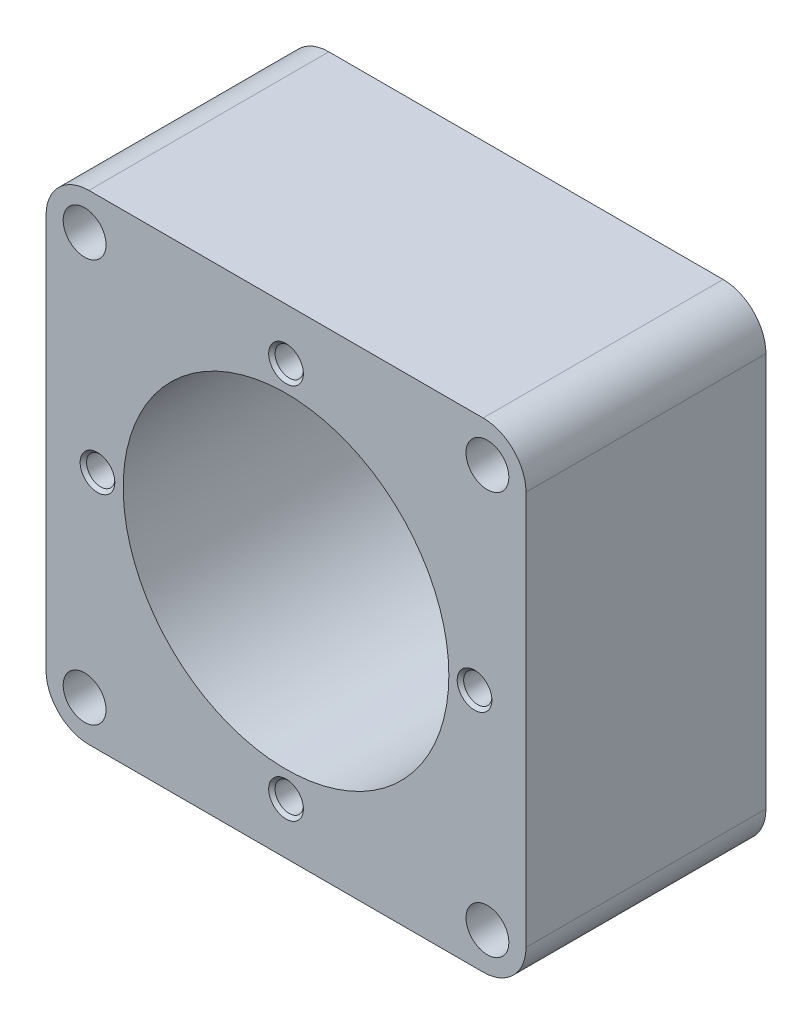
ISO-10303-21;
HEADER;
FILE_DESCRIPTION(('STEP AP214'),'2;1');
FILE_NAME('part.step','',(''),(''),'','','');
FILE_SCHEMA(('AUTOMOTIVE_DESIGN { 1 0 10303 214 1 1 1 1 }'));
ENDSEC;
DATA;
#1=APPLICATION_CONTEXT('core data for automotive mechanical design processes');
#2=APPLICATION_PROTOCOL_DEFINITION('international standard','automotive_design',2000,#1);
#3=PRODUCT_CONTEXT('',#1,'mechanical');
#4=PRODUCT('Part','Part','',(#3));
#5=PRODUCT_RELATED_PRODUCT_CATEGORY('part','',(#4));
#6=PRODUCT_DEFINITION_FORMATION('','',#4);
#7=PRODUCT_DEFINITION_CONTEXT('part definition',#1,'design');
#8=PRODUCT_DEFINITION('design','',#6,#7);
#9=PRODUCT_DEFINITION_SHAPE('','',#8);
#10=(LENGTH_UNIT() NAMED_UNIT(*) SI_UNIT(.MILLI.,.METRE.));
#11=(NAMED_UNIT(*) PLANE_ANGLE_UNIT() SI_UNIT($,.RADIAN.));
#12=(NAMED_UNIT(*) SI_UNIT($,.STERADIAN.) SOLID_ANGLE_UNIT());
#13=UNCERTAINTY_MEASURE_WITH_UNIT(LENGTH_MEASURE(1.E-05),#10,'distance_accuracy_value','');
#14=(GEOMETRIC_REPRESENTATION_CONTEXT(3) GLOBAL_UNCERTAINTY_ASSIGNED_CONTEXT((#13)) GLOBAL_UNIT_ASSIGNED_CONTEXT((#10,
#11,#12)) REPRESENTATION_CONTEXT('',''));
#15=CARTESIAN_POINT('',(0.,0.,0.));
#16=DIRECTION('',(0.,0.,1.));
#17=DIRECTION('',(1.,0.,0.));
#18=AXIS2_PLACEMENT_3D('',#15,#16,#17);
#19=CARTESIAN_POINT('',(28.,-28.,-28.));
#20=DIRECTION('',(1.,0.,0.));
#21=DIRECTION('',(0.,0.,-1.));
#22=AXIS2_PLACEMENT_3D('',#19,#20,#21);
#23=PLANE('',#22);
#24=DIRECTION('',(0.,1.,0.));
#25=VECTOR('',#24,1.);
#26=CARTESIAN_POINT('',(28.,-28.,0.));
#27=LINE('',#26,#25);
#28=CARTESIAN_POINT('',(28.,-23.,0.));
#29=VERTEX_POINT('',#28);
#30=CARTESIAN_POINT('',(28.,23.,0.));
#31=VERTEX_POINT('',#30);
#32=EDGE_CURVE('E185',#29,#31,#27,.T.);
#33=ORIENTED_EDGE('',*,*,#32,.F.);
#34=DIRECTION('',(0.,0.,1.));
#35=VECTOR('',#34,1.);
#36=CARTESIAN_POINT('',(28.,-23.,-28.));
#37=LINE('',#36,#35);
#38=CARTESIAN_POINT('',(28.,-23.,-28.));
#39=VERTEX_POINT('',#38);
#40=EDGE_CURVE('E226',#29,#39,#37,.F.);
#41=ORIENTED_EDGE('',*,*,#40,.T.);
#42=DIRECTION('',(0.,1.,0.));
#43=VECTOR('',#42,1.);
#44=CARTESIAN_POINT('',(28.,-28.,-28.));
#45=LINE('',#44,#43);
#46=CARTESIAN_POINT('',(28.,23.,-28.));
#47=VERTEX_POINT('',#46);
#48=EDGE_CURVE('E188',#39,#47,#45,.T.);
#49=ORIENTED_EDGE('',*,*,#48,.T.);
#50=DIRECTION('',(0.,0.,1.));
#51=VECTOR('',#50,1.);
#52=CARTESIAN_POINT('',(28.,23.,-28.));
#53=LINE('',#52,#51);
#54=EDGE_CURVE('E223',#47,#31,#53,.T.);
#55=ORIENTED_EDGE('',*,*,#54,.T.);
#56=EDGE_LOOP('',(#33,#41,#49,#55));
#57=FACE_BOUND('',#56,.T.);
#58=ADVANCED_FACE('F37',(#57),#23,.T.);
#59=CARTESIAN_POINT('',(-28.,-28.,-28.));
#60=DIRECTION('',(0.,-1.,0.));
#61=DIRECTION('',(0.,0.,-1.));
#62=AXIS2_PLACEMENT_3D('',#59,#60,#61);
#63=PLANE('',#62);
#64=DIRECTION('',(1.,0.,0.));
#65=VECTOR('',#64,1.);
#66=CARTESIAN_POINT('',(-28.,-28.,-28.));
#67=LINE('',#66,#65);
#68=CARTESIAN_POINT('',(-23.,-28.,-28.));
#69=VERTEX_POINT('',#68);
#70=CARTESIAN_POINT('',(23.,-28.,-28.));
#71=VERTEX_POINT('',#70);
#72=EDGE_CURVE('E197',#69,#71,#67,.T.);
#73=ORIENTED_EDGE('',*,*,#72,.T.);
#74=DIRECTION('',(0.,0.,1.));
#75=VECTOR('',#74,1.);
#76=CARTESIAN_POINT('',(23.,-28.,-28.));
#77=LINE('',#76,#75);
#78=CARTESIAN_POINT('',(23.,-28.,0.));
#79=VERTEX_POINT('',#78);
#80=EDGE_CURVE('E212',#71,#79,#77,.T.);
#81=ORIENTED_EDGE('',*,*,#80,.T.);
#82=DIRECTION('',(1.,0.,0.));
#83=VECTOR('',#82,1.);
#84=CARTESIAN_POINT('',(-28.,-28.,0.));
#85=LINE('',#84,#83);
#86=CARTESIAN_POINT('',(-23.,-28.,0.));
#87=VERTEX_POINT('',#86);
#88=EDGE_CURVE('E192',#87,#79,#85,.T.);
#89=ORIENTED_EDGE('',*,*,#88,.F.);
#90=DIRECTION('',(0.,0.,1.));
#91=VECTOR('',#90,1.);
#92=CARTESIAN_POINT('',(-23.,-28.,-28.));
#93=LINE('',#92,#91);
#94=EDGE_CURVE('E200',#87,#69,#93,.F.);
#95=ORIENTED_EDGE('',*,*,#94,.T.);
#96=EDGE_LOOP('',(#73,#81,#89,#95));
#97=FACE_BOUND('',#96,.T.);
#98=ADVANCED_FACE('F266',(#97),#63,.T.);
#99=CARTESIAN_POINT('',(-28.,-28.,-28.));
#100=DIRECTION('',(-1.,0.,0.));
#101=DIRECTION('',(0.,0.,1.));
#102=AXIS2_PLACEMENT_3D('',#99,#100,#101);
#103=PLANE('',#102);
#104=DIRECTION('',(0.,-1.,0.));
#105=VECTOR('',#104,1.);
#106=CARTESIAN_POINT('',(-28.,-28.,-28.));
#107=LINE('',#106,#105);
#108=CARTESIAN_POINT('',(-28.,23.,-28.));
#109=VERTEX_POINT('',#108);
#110=CARTESIAN_POINT('',(-28.,-23.,-28.));
#111=VERTEX_POINT('',#110);
#112=EDGE_CURVE('E194',#109,#111,#107,.T.);
#113=ORIENTED_EDGE('',*,*,#112,.T.);
#114=DIRECTION('',(0.,0.,1.));
#115=VECTOR('',#114,1.);
#116=CARTESIAN_POINT('',(-28.,-23.,-28.));
#117=LINE('',#116,#115);
#118=CARTESIAN_POINT('',(-28.,-23.,0.));
#119=VERTEX_POINT('',#118);
#120=EDGE_CURVE('E237',#111,#119,#117,.T.);
#121=ORIENTED_EDGE('',*,*,#120,.T.);
#122=DIRECTION('',(0.,-1.,0.));
#123=VECTOR('',#122,1.);
#124=CARTESIAN_POINT('',(-28.,-28.,0.));
#125=LINE('',#124,#123);
#126=CARTESIAN_POINT('',(-28.,23.,0.));
#127=VERTEX_POINT('',#126);
#128=EDGE_CURVE('E206',#127,#119,#125,.T.);
#129=ORIENTED_EDGE('',*,*,#128,.F.);
#130=DIRECTION('',(0.,0.,1.));
#131=VECTOR('',#130,1.);
#132=CARTESIAN_POINT('',(-28.,23.,-28.));
#133=LINE('',#132,#131);
#134=EDGE_CURVE('E235',#127,#109,#133,.F.);
#135=ORIENTED_EDGE('',*,*,#134,.T.);
#136=EDGE_LOOP('',(#113,#121,#129,#135));
#137=FACE_BOUND('',#136,.T.);
#138=ADVANCED_FACE('F242',(#137),#103,.T.);
#139=CARTESIAN_POINT('',(-28.,28.,-28.));
#140=DIRECTION('',(0.,1.,0.));
#141=DIRECTION('',(0.,0.,1.));
#142=AXIS2_PLACEMENT_3D('',#139,#140,#141);
#143=PLANE('',#142);
#144=DIRECTION('',(-1.,0.,0.));
#145=VECTOR('',#144,1.);
#146=CARTESIAN_POINT('',(-28.,28.,-28.));
#147=LINE('',#146,#145);
#148=CARTESIAN_POINT('',(23.,28.,-28.));
#149=VERTEX_POINT('',#148);
#150=CARTESIAN_POINT('',(-23.,28.,-28.));
#151=VERTEX_POINT('',#150);
#152=EDGE_CURVE('E191',#149,#151,#147,.T.);
#153=ORIENTED_EDGE('',*,*,#152,.T.);
#154=DIRECTION('',(0.,0.,1.));
#155=VECTOR('',#154,1.);
#156=CARTESIAN_POINT('',(-23.,28.,-28.));
#157=LINE('',#156,#155);
#158=CARTESIAN_POINT('',(-23.,28.,0.));
#159=VERTEX_POINT('',#158);
#160=EDGE_CURVE('E11',#151,#159,#157,.T.);
#161=ORIENTED_EDGE('',*,*,#160,.T.);
#162=DIRECTION('',(-1.,0.,0.));
#163=VECTOR('',#162,1.);
#164=CARTESIAN_POINT('',(-28.,28.,0.));
#165=LINE('',#164,#163);
#166=CARTESIAN_POINT('',(23.,28.,0.));
#167=VERTEX_POINT('',#166);
#168=EDGE_CURVE('E203',#167,#159,#165,.T.);
#169=ORIENTED_EDGE('',*,*,#168,.F.);
#170=DIRECTION('',(0.,0.,1.));
#171=VECTOR('',#170,1.);
#172=CARTESIAN_POINT('',(23.,28.,-28.));
#173=LINE('',#172,#171);
#174=EDGE_CURVE('E45',#167,#149,#173,.F.);
#175=ORIENTED_EDGE('',*,*,#174,.T.);
#176=EDGE_LOOP('',(#153,#161,#169,#175));
#177=FACE_BOUND('',#176,.T.);
#178=ADVANCED_FACE('F252',(#177),#143,.T.);
#179=CARTESIAN_POINT('',(0.,0.,-28.));
#180=DIRECTION('',(0.,0.,-1.));
#181=DIRECTION('',(-1.,0.,0.));
#182=AXIS2_PLACEMENT_3D('',#179,#180,#181);
#183=PLANE('',#182);
#184=CARTESIAN_POINT('',(-23.5,-23.5,-28.));
#185=DIRECTION('',(0.,0.,1.));
#186=DIRECTION('',(1.,0.,0.));
#187=AXIS2_PLACEMENT_3D('',#184,#185,#186);
#188=CIRCLE('',#187,2.5);
#189=CARTESIAN_POINT('',(-21.,-23.5,-28.));
#190=VERTEX_POINT('',#189);
#191=EDGE_CURVE('E177',#190,#190,#188,.T.);
#192=ORIENTED_EDGE('',*,*,#191,.T.);
#193=EDGE_LOOP('',(#192));
#194=FACE_BOUND('',#193,.T.);
#195=CARTESIAN_POINT('',(23.5,-23.5,-28.));
#196=DIRECTION('',(0.,0.,1.));
#197=DIRECTION('',(1.,0.,0.));
#198=AXIS2_PLACEMENT_3D('',#195,#196,#197);
#199=CIRCLE('',#198,2.5);
#200=CARTESIAN_POINT('',(26.,-23.5,-28.));
#201=VERTEX_POINT('',#200);
#202=EDGE_CURVE('E171',#201,#201,#199,.T.);
#203=ORIENTED_EDGE('',*,*,#202,.T.);
#204=EDGE_LOOP('',(#203));
#205=FACE_BOUND('',#204,.T.);
#206=CARTESIAN_POINT('',(23.5,23.5,-28.));
#207=DIRECTION('',(0.,0.,1.));
#208=DIRECTION('',(1.,0.,0.));
#209=AXIS2_PLACEMENT_3D('',#206,#207,#208);
#210=CIRCLE('',#209,2.5);
#211=CARTESIAN_POINT('',(26.,23.5,-28.));
#212=VERTEX_POINT('',#211);
#213=EDGE_CURVE('E165',#212,#212,#210,.T.);
#214=ORIENTED_EDGE('',*,*,#213,.T.);
#215=EDGE_LOOP('',(#214));
#216=FACE_BOUND('',#215,.T.);
#217=CARTESIAN_POINT('',(-23.5,23.5,-28.));
#218=DIRECTION('',(0.,0.,1.));
#219=DIRECTION('',(1.,0.,0.));
#220=AXIS2_PLACEMENT_3D('',#217,#218,#219);
#221=CIRCLE('',#220,2.5);
#222=CARTESIAN_POINT('',(-21.,23.5,-28.));
#223=VERTEX_POINT('',#222);
#224=EDGE_CURVE('E158',#223,#223,#221,.T.);
#225=ORIENTED_EDGE('',*,*,#224,.T.);
#226=EDGE_LOOP('',(#225));
#227=FACE_BOUND('',#226,.T.);
#228=CARTESIAN_POINT('',(0.,0.,-28.));
#229=DIRECTION('',(0.,0.,1.));
#230=DIRECTION('',(1.,0.,0.));
#231=AXIS2_PLACEMENT_3D('',#228,#229,#230);
#232=CIRCLE('',#231,19.);
#233=CARTESIAN_POINT('',(19.,0.,-28.));
#234=VERTEX_POINT('',#233);
#235=EDGE_CURVE('E182',#234,#234,#232,.T.);
#236=ORIENTED_EDGE('',*,*,#235,.T.);
#237=EDGE_LOOP('',(#236));
#238=FACE_BOUND('',#237,.T.);
#239=ORIENTED_EDGE('',*,*,#48,.F.);
#240=CARTESIAN_POINT('',(23.,-23.,-28.));
#241=DIRECTION('',(0.,0.,-1.));
#242=DIRECTION('',(-1.,0.,0.));
#243=AXIS2_PLACEMENT_3D('',#240,#241,#242);
#244=CIRCLE('',#243,5.);
#245=EDGE_CURVE('E233',#39,#71,#244,.T.);
#246=ORIENTED_EDGE('',*,*,#245,.T.);
#247=ORIENTED_EDGE('',*,*,#72,.F.);
#248=CARTESIAN_POINT('',(-23.,-23.,-28.));
#249=DIRECTION('',(0.,0.,-1.));
#250=DIRECTION('',(-1.,0.,0.));
#251=AXIS2_PLACEMENT_3D('',#248,#249,#250);
#252=CIRCLE('',#251,5.);
#253=EDGE_CURVE('E231',#69,#111,#252,.T.);
#254=ORIENTED_EDGE('',*,*,#253,.T.);
#255=ORIENTED_EDGE('',*,*,#112,.F.);
#256=CARTESIAN_POINT('',(-23.,23.,-28.));
#257=DIRECTION('',(0.,0.,-1.));
#258=DIRECTION('',(-1.,0.,0.));
#259=AXIS2_PLACEMENT_3D('',#256,#257,#258);
#260=CIRCLE('',#259,5.);
#261=EDGE_CURVE('E52',#109,#151,#260,.T.);
#262=ORIENTED_EDGE('',*,*,#261,.T.);
#263=ORIENTED_EDGE('',*,*,#152,.F.);
#264=CARTESIAN_POINT('',(23.,23.,-28.));
#265=DIRECTION('',(0.,0.,-1.));
#266=DIRECTION('',(-1.,0.,0.));
#267=AXIS2_PLACEMENT_3D('',#264,#265,#266);
#268=CIRCLE('',#267,5.);
#269=EDGE_CURVE('E228',#149,#47,#268,.T.);
#270=ORIENTED_EDGE('',*,*,#269,.T.);
#271=EDGE_LOOP('',(#239,#246,#247,#254,#255,#262,#263,#270));
#272=FACE_BOUND('',#271,.T.);
#273=ADVANCED_FACE('F255',(#194,#205,#216,#227,#238,#272),#183,.T.);
#274=CARTESIAN_POINT('',(0.,0.,0.));
#275=DIRECTION('',(0.,0.,-1.));
#276=DIRECTION('',(-1.,0.,0.));
#277=AXIS2_PLACEMENT_3D('',#274,#275,#276);
#278=PLANE('',#277);
#279=CARTESIAN_POINT('',(0.,22.,0.));
#280=DIRECTION('',(0.,0.,1.));
#281=DIRECTION('',(1.,0.,0.));
#282=AXIS2_PLACEMENT_3D('',#279,#280,#281);
#283=CIRCLE('',#282,2.025);
#284=CARTESIAN_POINT('',(2.025,22.,0.));
#285=VERTEX_POINT('',#284);
#286=EDGE_CURVE('E130',#285,#285,#283,.T.);
#287=ORIENTED_EDGE('',*,*,#286,.F.);
#288=EDGE_LOOP('',(#287));
#289=FACE_BOUND('',#288,.T.);
#290=CARTESIAN_POINT('',(-21.9999999999994,-6.23930495989826E-13,0.));
#291=DIRECTION('',(0.,0.,1.));
#292=DIRECTION('',(1.,0.,0.));
#293=AXIS2_PLACEMENT_3D('',#290,#291,#292);
#294=CIRCLE('',#293,2.025);
#295=CARTESIAN_POINT('',(-19.9749999999994,-6.23930495989826E-13,0.));
#296=VERTEX_POINT('',#295);
#297=EDGE_CURVE('E123',#296,#296,#294,.T.);
#298=ORIENTED_EDGE('',*,*,#297,.F.);
#299=EDGE_LOOP('',(#298));
#300=FACE_BOUND('',#299,.T.);
#301=CARTESIAN_POINT('',(1.2424725460634E-12,-22.,0.));
#302=DIRECTION('',(0.,0.,1.));
#303=DIRECTION('',(1.,0.,0.));
#304=AXIS2_PLACEMENT_3D('',#301,#302,#303);
#305=CIRCLE('',#304,2.025);
#306=CARTESIAN_POINT('',(2.02500000000124,-22.,0.));
#307=VERTEX_POINT('',#306);
#308=EDGE_CURVE('E139',#307,#307,#305,.T.);
#309=ORIENTED_EDGE('',*,*,#308,.F.);
#310=EDGE_LOOP('',(#309));
#311=FACE_BOUND('',#310,.T.);
#312=CARTESIAN_POINT('',(22.0000000000006,6.21236273031702E-13,0.));
#313=DIRECTION('',(0.,0.,1.));
#314=DIRECTION('',(1.,0.,0.));
#315=AXIS2_PLACEMENT_3D('',#312,#313,#314);
#316=CIRCLE('',#315,2.025);
#317=CARTESIAN_POINT('',(24.0250000000006,6.21236273031702E-13,0.));
#318=VERTEX_POINT('',#317);
#319=EDGE_CURVE('E148',#318,#318,#316,.T.);
#320=ORIENTED_EDGE('',*,*,#319,.F.);
#321=EDGE_LOOP('',(#320));
#322=FACE_BOUND('',#321,.T.);
#323=CARTESIAN_POINT('',(-23.5,-23.5,0.));
#324=DIRECTION('',(0.,0.,1.));
#325=DIRECTION('',(1.,0.,0.));
#326=AXIS2_PLACEMENT_3D('',#323,#324,#325);
#327=CIRCLE('',#326,2.5);
#328=CARTESIAN_POINT('',(-21.,-23.5,0.));
#329=VERTEX_POINT('',#328);
#330=EDGE_CURVE('E157',#329,#329,#327,.T.);
#331=ORIENTED_EDGE('',*,*,#330,.F.);
#332=EDGE_LOOP('',(#331));
#333=FACE_BOUND('',#332,.T.);
#334=CARTESIAN_POINT('',(23.5,-23.5,0.));
#335=DIRECTION('',(0.,0.,1.));
#336=DIRECTION('',(1.,0.,0.));
#337=AXIS2_PLACEMENT_3D('',#334,#335,#336);
#338=CIRCLE('',#337,2.5);
#339=CARTESIAN_POINT('',(26.,-23.5,0.));
#340=VERTEX_POINT('',#339);
#341=EDGE_CURVE('E174',#340,#340,#338,.T.);
#342=ORIENTED_EDGE('',*,*,#341,.F.);
#343=EDGE_LOOP('',(#342));
#344=FACE_BOUND('',#343,.T.);
#345=CARTESIAN_POINT('',(23.5,23.5,0.));
#346=DIRECTION('',(0.,0.,1.));
#347=DIRECTION('',(1.,0.,0.));
#348=AXIS2_PLACEMENT_3D('',#345,#346,#347);
#349=CIRCLE('',#348,2.5);
#350=CARTESIAN_POINT('',(26.,23.5,0.));
#351=VERTEX_POINT('',#350);
#352=EDGE_CURVE('E168',#351,#351,#349,.T.);
#353=ORIENTED_EDGE('',*,*,#352,.F.);
#354=EDGE_LOOP('',(#353));
#355=FACE_BOUND('',#354,.T.);
#356=CARTESIAN_POINT('',(-23.5,23.5,0.));
#357=DIRECTION('',(0.,0.,1.));
#358=DIRECTION('',(1.,0.,0.));
#359=AXIS2_PLACEMENT_3D('',#356,#357,#358);
#360=CIRCLE('',#359,2.5);
#361=CARTESIAN_POINT('',(-21.,23.5,0.));
#362=VERTEX_POINT('',#361);
#363=EDGE_CURVE('E162',#362,#362,#360,.T.);
#364=ORIENTED_EDGE('',*,*,#363,.F.);
#365=EDGE_LOOP('',(#364));
#366=FACE_BOUND('',#365,.T.);
#367=CARTESIAN_POINT('',(0.,0.,0.));
#368=DIRECTION('',(0.,0.,1.));
#369=DIRECTION('',(1.,0.,0.));
#370=AXIS2_PLACEMENT_3D('',#367,#368,#369);
#371=CIRCLE('',#370,19.);
#372=CARTESIAN_POINT('',(19.,0.,0.));
#373=VERTEX_POINT('',#372);
#374=EDGE_CURVE('E161',#373,#373,#371,.T.);
#375=ORIENTED_EDGE('',*,*,#374,.F.);
#376=EDGE_LOOP('',(#375));
#377=FACE_BOUND('',#376,.T.);
#378=ORIENTED_EDGE('',*,*,#88,.T.);
#379=CARTESIAN_POINT('',(23.,-23.,0.));
#380=DIRECTION('',(0.,0.,-1.));
#381=DIRECTION('',(-1.,0.,0.));
#382=AXIS2_PLACEMENT_3D('',#379,#380,#381);
#383=CIRCLE('',#382,5.);
#384=EDGE_CURVE('E221',#79,#29,#383,.F.);
#385=ORIENTED_EDGE('',*,*,#384,.T.);
#386=ORIENTED_EDGE('',*,*,#32,.T.);
#387=CARTESIAN_POINT('',(23.,23.,0.));
#388=DIRECTION('',(0.,0.,-1.));
#389=DIRECTION('',(-1.,0.,0.));
#390=AXIS2_PLACEMENT_3D('',#387,#388,#389);
#391=CIRCLE('',#390,5.);
#392=EDGE_CURVE('E215',#31,#167,#391,.F.);
#393=ORIENTED_EDGE('',*,*,#392,.T.);
#394=ORIENTED_EDGE('',*,*,#168,.T.);
#395=CARTESIAN_POINT('',(-23.,23.,0.));
#396=DIRECTION('',(0.,0.,-1.));
#397=DIRECTION('',(-1.,0.,0.));
#398=AXIS2_PLACEMENT_3D('',#395,#396,#397);
#399=CIRCLE('',#398,5.);
#400=EDGE_CURVE('E217',#159,#127,#399,.F.);
#401=ORIENTED_EDGE('',*,*,#400,.T.);
#402=ORIENTED_EDGE('',*,*,#128,.T.);
#403=CARTESIAN_POINT('',(-23.,-23.,0.));
#404=DIRECTION('',(0.,0.,-1.));
#405=DIRECTION('',(-1.,0.,0.));
#406=AXIS2_PLACEMENT_3D('',#403,#404,#405);
#407=CIRCLE('',#406,5.);
#408=EDGE_CURVE('E219',#119,#87,#407,.F.);
#409=ORIENTED_EDGE('',*,*,#408,.T.);
#410=EDGE_LOOP('',(#378,#385,#386,#393,#394,#401,#402,#409));
#411=FACE_BOUND('',#410,.T.);
#412=ADVANCED_FACE('F247',(#289,#300,#311,#322,#333,#344,#355,#366,#377,#411),#278,.F.);
#413=CARTESIAN_POINT('',(0.,0.,-28.));
#414=DIRECTION('',(0.,0.,1.));
#415=DIRECTION('',(1.,0.,0.));
#416=AXIS2_PLACEMENT_3D('',#413,#414,#415);
#417=CYLINDRICAL_SURFACE('',#416,19.);
#418=ORIENTED_EDGE('',*,*,#235,.F.);
#419=EDGE_LOOP('',(#418));
#420=FACE_BOUND('',#419,.T.);
#421=ORIENTED_EDGE('',*,*,#374,.T.);
#422=EDGE_LOOP('',(#421));
#423=FACE_BOUND('',#422,.T.);
#424=ADVANCED_FACE('F291',(#420,#423),#417,.F.);
#425=CARTESIAN_POINT('',(-23.5,23.5,-28.));
#426=DIRECTION('',(0.,0.,1.));
#427=DIRECTION('',(1.,0.,0.));
#428=AXIS2_PLACEMENT_3D('',#425,#426,#427);
#429=CYLINDRICAL_SURFACE('',#428,2.5);
#430=ORIENTED_EDGE('',*,*,#224,.F.);
#431=EDGE_LOOP('',(#430));
#432=FACE_BOUND('',#431,.T.);
#433=ORIENTED_EDGE('',*,*,#363,.T.);
#434=EDGE_LOOP('',(#433));
#435=FACE_BOUND('',#434,.T.);
#436=ADVANCED_FACE('F298',(#432,#435),#429,.F.);
#437=CARTESIAN_POINT('',(23.5,23.5,-28.));
#438=DIRECTION('',(0.,0.,1.));
#439=DIRECTION('',(1.,0.,0.));
#440=AXIS2_PLACEMENT_3D('',#437,#438,#439);
#441=CYLINDRICAL_SURFACE('',#440,2.5);
#442=ORIENTED_EDGE('',*,*,#213,.F.);
#443=EDGE_LOOP('',(#442));
#444=FACE_BOUND('',#443,.T.);
#445=ORIENTED_EDGE('',*,*,#352,.T.);
#446=EDGE_LOOP('',(#445));
#447=FACE_BOUND('',#446,.T.);
#448=ADVANCED_FACE('F306',(#444,#447),#441,.F.);
#449=CARTESIAN_POINT('',(23.5,-23.5,-28.));
#450=DIRECTION('',(0.,0.,1.));
#451=DIRECTION('',(1.,0.,0.));
#452=AXIS2_PLACEMENT_3D('',#449,#450,#451);
#453=CYLINDRICAL_SURFACE('',#452,2.5);
#454=ORIENTED_EDGE('',*,*,#202,.F.);
#455=EDGE_LOOP('',(#454));
#456=FACE_BOUND('',#455,.T.);
#457=ORIENTED_EDGE('',*,*,#341,.T.);
#458=EDGE_LOOP('',(#457));
#459=FACE_BOUND('',#458,.T.);
#460=ADVANCED_FACE('F302',(#456,#459),#453,.F.);
#461=CARTESIAN_POINT('',(-23.5,-23.5,-28.));
#462=DIRECTION('',(0.,0.,1.));
#463=DIRECTION('',(1.,0.,0.));
#464=AXIS2_PLACEMENT_3D('',#461,#462,#463);
#465=CYLINDRICAL_SURFACE('',#464,2.5);
#466=ORIENTED_EDGE('',*,*,#191,.F.);
#467=EDGE_LOOP('',(#466));
#468=FACE_BOUND('',#467,.T.);
#469=ORIENTED_EDGE('',*,*,#330,.T.);
#470=EDGE_LOOP('',(#469));
#471=FACE_BOUND('',#470,.T.);
#472=ADVANCED_FACE('F276',(#468,#471),#465,.F.);
#473=CARTESIAN_POINT('',(23.,-23.,-28.));
#474=DIRECTION('',(0.,0.,1.));
#475=DIRECTION('',(1.,0.,0.));
#476=AXIS2_PLACEMENT_3D('',#473,#474,#475);
#477=CYLINDRICAL_SURFACE('',#476,5.);
#478=ORIENTED_EDGE('',*,*,#245,.F.);
#479=ORIENTED_EDGE('',*,*,#40,.F.);
#480=ORIENTED_EDGE('',*,*,#384,.F.);
#481=ORIENTED_EDGE('',*,*,#80,.F.);
#482=EDGE_LOOP('',(#478,#479,#480,#481));
#483=FACE_BOUND('',#482,.T.);
#484=ADVANCED_FACE('F264',(#483),#477,.T.);
#485=CARTESIAN_POINT('',(-23.,-23.,-28.));
#486=DIRECTION('',(0.,0.,1.));
#487=DIRECTION('',(1.,0.,0.));
#488=AXIS2_PLACEMENT_3D('',#485,#486,#487);
#489=CYLINDRICAL_SURFACE('',#488,5.);
#490=ORIENTED_EDGE('',*,*,#253,.F.);
#491=ORIENTED_EDGE('',*,*,#94,.F.);
#492=ORIENTED_EDGE('',*,*,#408,.F.);
#493=ORIENTED_EDGE('',*,*,#120,.F.);
#494=EDGE_LOOP('',(#490,#491,#492,#493));
#495=FACE_BOUND('',#494,.T.);
#496=ADVANCED_FACE('F269',(#495),#489,.T.);
#497=CARTESIAN_POINT('',(-23.,23.,-28.));
#498=DIRECTION('',(0.,0.,1.));
#499=DIRECTION('',(1.,0.,0.));
#500=AXIS2_PLACEMENT_3D('',#497,#498,#499);
#501=CYLINDRICAL_SURFACE('',#500,5.);
#502=ORIENTED_EDGE('',*,*,#261,.F.);
#503=ORIENTED_EDGE('',*,*,#134,.F.);
#504=ORIENTED_EDGE('',*,*,#400,.F.);
#505=ORIENTED_EDGE('',*,*,#160,.F.);
#506=EDGE_LOOP('',(#502,#503,#504,#505));
#507=FACE_BOUND('',#506,.T.);
#508=ADVANCED_FACE('F251',(#507),#501,.T.);
#509=CARTESIAN_POINT('',(23.,23.,-28.));
#510=DIRECTION('',(0.,0.,1.));
#511=DIRECTION('',(1.,0.,0.));
#512=AXIS2_PLACEMENT_3D('',#509,#510,#511);
#513=CYLINDRICAL_SURFACE('',#512,5.);
#514=ORIENTED_EDGE('',*,*,#269,.F.);
#515=ORIENTED_EDGE('',*,*,#174,.F.);
#516=ORIENTED_EDGE('',*,*,#392,.F.);
#517=ORIENTED_EDGE('',*,*,#54,.F.);
#518=EDGE_LOOP('',(#514,#515,#516,#517));
#519=FACE_BOUND('',#518,.T.);
#520=ADVANCED_FACE('F39',(#519),#513,.T.);
#521=CARTESIAN_POINT('',(22.0000000000006,6.21236273031702E-13,-12.1));
#522=DIRECTION('',(0.,0.,1.));
#523=DIRECTION('',(1.,0.,0.));
#524=AXIS2_PLACEMENT_3D('',#521,#522,#523);
#525=CONICAL_SURFACE('',#524,1.65,1.02974425867665);
#526=CARTESIAN_POINT('',(22.0000000000006,6.21236273031702E-13,-13.0914200213955));
#527=VERTEX_POINT('',#526);
#528=VERTEX_LOOP('',#527);
#529=FACE_BOUND('',#528,.T.);
#530=CARTESIAN_POINT('',(22.0000000000006,6.21236273031702E-13,-12.1));
#531=DIRECTION('',(0.,0.,1.));
#532=DIRECTION('',(1.,0.,0.));
#533=AXIS2_PLACEMENT_3D('',#530,#531,#532);
#534=CIRCLE('',#533,1.65);
#535=CARTESIAN_POINT('',(23.6500000000006,6.21236273031702E-13,-12.1));
#536=VERTEX_POINT('',#535);
#537=EDGE_CURVE('E154',#536,#536,#534,.T.);
#538=ORIENTED_EDGE('',*,*,#537,.T.);
#539=EDGE_LOOP('',(#538));
#540=FACE_BOUND('',#539,.T.);
#541=ADVANCED_FACE('F314',(#529,#540),#525,.F.);
#542=CARTESIAN_POINT('',(22.0000000000006,6.21236273031702E-13,0.));
#543=DIRECTION('',(0.,0.,1.));
#544=DIRECTION('',(1.,0.,0.));
#545=AXIS2_PLACEMENT_3D('',#542,#543,#544);
#546=CYLINDRICAL_SURFACE('',#545,1.65);
#547=ORIENTED_EDGE('',*,*,#537,.F.);
#548=EDGE_LOOP('',(#547));
#549=FACE_BOUND('',#548,.T.);
#550=CARTESIAN_POINT('',(22.0000000000006,6.21236273031702E-13,-0.375));
#551=DIRECTION('',(0.,0.,1.));
#552=DIRECTION('',(1.,0.,0.));
#553=AXIS2_PLACEMENT_3D('',#550,#551,#552);
#554=CIRCLE('',#553,1.65);
#555=CARTESIAN_POINT('',(23.6500000000006,6.21236273031702E-13,-0.375));
#556=VERTEX_POINT('',#555);
#557=EDGE_CURVE('E151',#556,#556,#554,.T.);
#558=ORIENTED_EDGE('',*,*,#557,.T.);
#559=EDGE_LOOP('',(#558));
#560=FACE_BOUND('',#559,.T.);
#561=ADVANCED_FACE('F317',(#549,#560),#546,.F.);
#562=CARTESIAN_POINT('',(22.0000000000006,6.21236273031702E-13,0.));
#563=DIRECTION('',(0.,0.,1.));
#564=DIRECTION('',(1.,0.,0.));
#565=AXIS2_PLACEMENT_3D('',#562,#563,#564);
#566=CONICAL_SURFACE('',#565,2.025,0.785398163397446);
#567=ORIENTED_EDGE('',*,*,#557,.F.);
#568=EDGE_LOOP('',(#567));
#569=FACE_BOUND('',#568,.T.);
#570=ORIENTED_EDGE('',*,*,#319,.T.);
#571=EDGE_LOOP('',(#570));
#572=FACE_BOUND('',#571,.T.);
#573=ADVANCED_FACE('F321',(#569,#572),#566,.F.);
#574=CARTESIAN_POINT('',(1.2424725460634E-12,-22.,-12.1));
#575=DIRECTION('',(0.,0.,1.));
#576=DIRECTION('',(1.,0.,0.));
#577=AXIS2_PLACEMENT_3D('',#574,#575,#576);
#578=CONICAL_SURFACE('',#577,1.65,1.02974425867665);
#579=CARTESIAN_POINT('',(1.2392660729383E-12,-22.,-13.0914200213955));
#580=VERTEX_POINT('',#579);
#581=VERTEX_LOOP('',#580);
#582=FACE_BOUND('',#581,.T.);
#583=CARTESIAN_POINT('',(1.2424725460634E-12,-22.,-12.1));
#584=DIRECTION('',(0.,0.,1.));
#585=DIRECTION('',(1.,0.,0.));
#586=AXIS2_PLACEMENT_3D('',#583,#584,#585);
#587=CIRCLE('',#586,1.65);
#588=CARTESIAN_POINT('',(1.65000000000124,-22.,-12.1));
#589=VERTEX_POINT('',#588);
#590=EDGE_CURVE('E145',#589,#589,#587,.T.);
#591=ORIENTED_EDGE('',*,*,#590,.T.);
#592=EDGE_LOOP('',(#591));
#593=FACE_BOUND('',#592,.T.);
#594=ADVANCED_FACE('F325',(#582,#593),#578,.F.);
#595=CARTESIAN_POINT('',(1.2424725460634E-12,-22.,0.));
#596=DIRECTION('',(0.,0.,1.));
#597=DIRECTION('',(1.,0.,0.));
#598=AXIS2_PLACEMENT_3D('',#595,#596,#597);
#599=CYLINDRICAL_SURFACE('',#598,1.65);
#600=ORIENTED_EDGE('',*,*,#590,.F.);
#601=EDGE_LOOP('',(#600));
#602=FACE_BOUND('',#601,.T.);
#603=CARTESIAN_POINT('',(1.2424725460634E-12,-22.,-0.375));
#604=DIRECTION('',(0.,0.,1.));
#605=DIRECTION('',(1.,0.,0.));
#606=AXIS2_PLACEMENT_3D('',#603,#604,#605);
#607=CIRCLE('',#606,1.65);
#608=CARTESIAN_POINT('',(1.65000000000124,-22.,-0.375));
#609=VERTEX_POINT('',#608);
#610=EDGE_CURVE('E142',#609,#609,#607,.T.);
#611=ORIENTED_EDGE('',*,*,#610,.T.);
#612=EDGE_LOOP('',(#611));
#613=FACE_BOUND('',#612,.T.);
#614=ADVANCED_FACE('F329',(#602,#613),#599,.F.);
#615=CARTESIAN_POINT('',(1.2424725460634E-12,-22.,0.));
#616=DIRECTION('',(0.,0.,1.));
#617=DIRECTION('',(1.,0.,0.));
#618=AXIS2_PLACEMENT_3D('',#615,#616,#617);
#619=CONICAL_SURFACE('',#618,2.025,0.785398163397446);
#620=ORIENTED_EDGE('',*,*,#610,.F.);
#621=EDGE_LOOP('',(#620));
#622=FACE_BOUND('',#621,.T.);
#623=ORIENTED_EDGE('',*,*,#308,.T.);
#624=EDGE_LOOP('',(#623));
#625=FACE_BOUND('',#624,.T.);
#626=ADVANCED_FACE('F333',(#622,#625),#619,.F.);
#627=CARTESIAN_POINT('',(-21.9999999999994,-6.23930495989826E-13,-12.1));
#628=DIRECTION('',(0.,0.,1.));
#629=DIRECTION('',(1.,0.,0.));
#630=AXIS2_PLACEMENT_3D('',#627,#628,#629);
#631=CONICAL_SURFACE('',#630,1.65,1.02974425867665);
#632=CARTESIAN_POINT('',(-21.9999999999994,-6.23930495989826E-13,-13.0914200213955));
#633=VERTEX_POINT('',#632);
#634=VERTEX_LOOP('',#633);
#635=FACE_BOUND('',#634,.T.);
#636=CARTESIAN_POINT('',(-21.9999999999994,-6.23930495989826E-13,-12.1));
#637=DIRECTION('',(0.,0.,1.));
#638=DIRECTION('',(1.,0.,0.));
#639=AXIS2_PLACEMENT_3D('',#636,#637,#638);
#640=CIRCLE('',#639,1.65);
#641=CARTESIAN_POINT('',(-20.3499999999994,-6.23930495989826E-13,-12.1));
#642=VERTEX_POINT('',#641);
#643=EDGE_CURVE('E136',#642,#642,#640,.T.);
#644=ORIENTED_EDGE('',*,*,#643,.T.);
#645=EDGE_LOOP('',(#644));
#646=FACE_BOUND('',#645,.T.);
#647=ADVANCED_FACE('F337',(#635,#646),#631,.F.);
#648=CARTESIAN_POINT('',(-21.9999999999994,-6.23930495989826E-13,0.));
#649=DIRECTION('',(0.,0.,1.));
#650=DIRECTION('',(1.,0.,0.));
#651=AXIS2_PLACEMENT_3D('',#648,#649,#650);
#652=CYLINDRICAL_SURFACE('',#651,1.65);
#653=ORIENTED_EDGE('',*,*,#643,.F.);
#654=EDGE_LOOP('',(#653));
#655=FACE_BOUND('',#654,.T.);
#656=CARTESIAN_POINT('',(-21.9999999999994,-6.23930495989826E-13,-0.375));
#657=DIRECTION('',(0.,0.,1.));
#658=DIRECTION('',(1.,0.,0.));
#659=AXIS2_PLACEMENT_3D('',#656,#657,#658);
#660=CIRCLE('',#659,1.65);
#661=CARTESIAN_POINT('',(-20.3499999999994,-6.23930495989826E-13,-0.375));
#662=VERTEX_POINT('',#661);
#663=EDGE_CURVE('E127',#662,#662,#660,.T.);
#664=ORIENTED_EDGE('',*,*,#663,.T.);
#665=EDGE_LOOP('',(#664));
#666=FACE_BOUND('',#665,.T.);
#667=ADVANCED_FACE('F341',(#655,#666),#652,.F.);
#668=CARTESIAN_POINT('',(-21.9999999999994,-6.23930495989826E-13,0.));
#669=DIRECTION('',(0.,0.,1.));
#670=DIRECTION('',(1.,0.,0.));
#671=AXIS2_PLACEMENT_3D('',#668,#669,#670);
#672=CONICAL_SURFACE('',#671,2.025,0.785398163397446);
#673=ORIENTED_EDGE('',*,*,#663,.F.);
#674=EDGE_LOOP('',(#673));
#675=FACE_BOUND('',#674,.T.);
#676=ORIENTED_EDGE('',*,*,#297,.T.);
#677=EDGE_LOOP('',(#676));
#678=FACE_BOUND('',#677,.T.);
#679=ADVANCED_FACE('F117',(#675,#678),#672,.F.);
#680=CARTESIAN_POINT('',(0.,22.,-12.1));
#681=DIRECTION('',(0.,0.,1.));
#682=DIRECTION('',(1.,0.,0.));
#683=AXIS2_PLACEMENT_3D('',#680,#681,#682);
#684=CONICAL_SURFACE('',#683,1.65,1.02974425867665);
#685=CARTESIAN_POINT('',(0.,22.,-13.0914200213955));
#686=VERTEX_POINT('',#685);
#687=VERTEX_LOOP('',#686);
#688=FACE_BOUND('',#687,.T.);
#689=CARTESIAN_POINT('',(0.,22.,-12.1));
#690=DIRECTION('',(0.,0.,1.));
#691=DIRECTION('',(1.,0.,0.));
#692=AXIS2_PLACEMENT_3D('',#689,#690,#691);
#693=CIRCLE('',#692,1.65);
#694=CARTESIAN_POINT('',(1.65,22.,-12.1));
#695=VERTEX_POINT('',#694);
#696=EDGE_CURVE('E121',#695,#695,#693,.T.);
#697=ORIENTED_EDGE('',*,*,#696,.T.);
#698=EDGE_LOOP('',(#697));
#699=FACE_BOUND('',#698,.T.);
#700=ADVANCED_FACE('F113',(#688,#699),#684,.F.);
#701=CARTESIAN_POINT('',(0.,22.,0.));
#702=DIRECTION('',(0.,0.,1.));
#703=DIRECTION('',(1.,0.,0.));
#704=AXIS2_PLACEMENT_3D('',#701,#702,#703);
#705=CYLINDRICAL_SURFACE('',#704,1.65);
#706=ORIENTED_EDGE('',*,*,#696,.F.);
#707=EDGE_LOOP('',(#706));
#708=FACE_BOUND('',#707,.T.);
#709=CARTESIAN_POINT('',(0.,22.,-0.375));
#710=DIRECTION('',(0.,0.,1.));
#711=DIRECTION('',(1.,0.,0.));
#712=AXIS2_PLACEMENT_3D('',#709,#710,#711);
#713=CIRCLE('',#712,1.65);
#714=CARTESIAN_POINT('',(1.65,22.,-0.375));
#715=VERTEX_POINT('',#714);
#716=EDGE_CURVE('E124',#715,#715,#713,.T.);
#717=ORIENTED_EDGE('',*,*,#716,.T.);
#718=EDGE_LOOP('',(#717));
#719=FACE_BOUND('',#718,.T.);
#720=ADVANCED_FACE('F116',(#708,#719),#705,.F.);
#721=CARTESIAN_POINT('',(0.,22.,0.));
#722=DIRECTION('',(0.,0.,1.));
#723=DIRECTION('',(1.,0.,0.));
#724=AXIS2_PLACEMENT_3D('',#721,#722,#723);
#725=CONICAL_SURFACE('',#724,2.025,0.785398163397446);
#726=ORIENTED_EDGE('',*,*,#716,.F.);
#727=EDGE_LOOP('',(#726));
#728=FACE_BOUND('',#727,.T.);
#729=ORIENTED_EDGE('',*,*,#286,.T.);
#730=EDGE_LOOP('',(#729));
#731=FACE_BOUND('',#730,.T.);
#732=ADVANCED_FACE('F351',(#728,#731),#725,.F.);
#733=CLOSED_SHELL('',(#58,#98,#138,#178,#273,#412,#424,#436,#448,#460,#472,#484,#496,#508,#520,
#541,#561,#573,#594,#614,#626,#647,#667,#679,#700,#720,#732));
#734=MANIFOLD_SOLID_BREP('B2',#733);
#735=ADVANCED_BREP_SHAPE_REPRESENTATION('',(#18,#734),#14);
#736=SHAPE_DEFINITION_REPRESENTATION(#9,#735);
ENDSEC;
END-ISO-10303-21;
